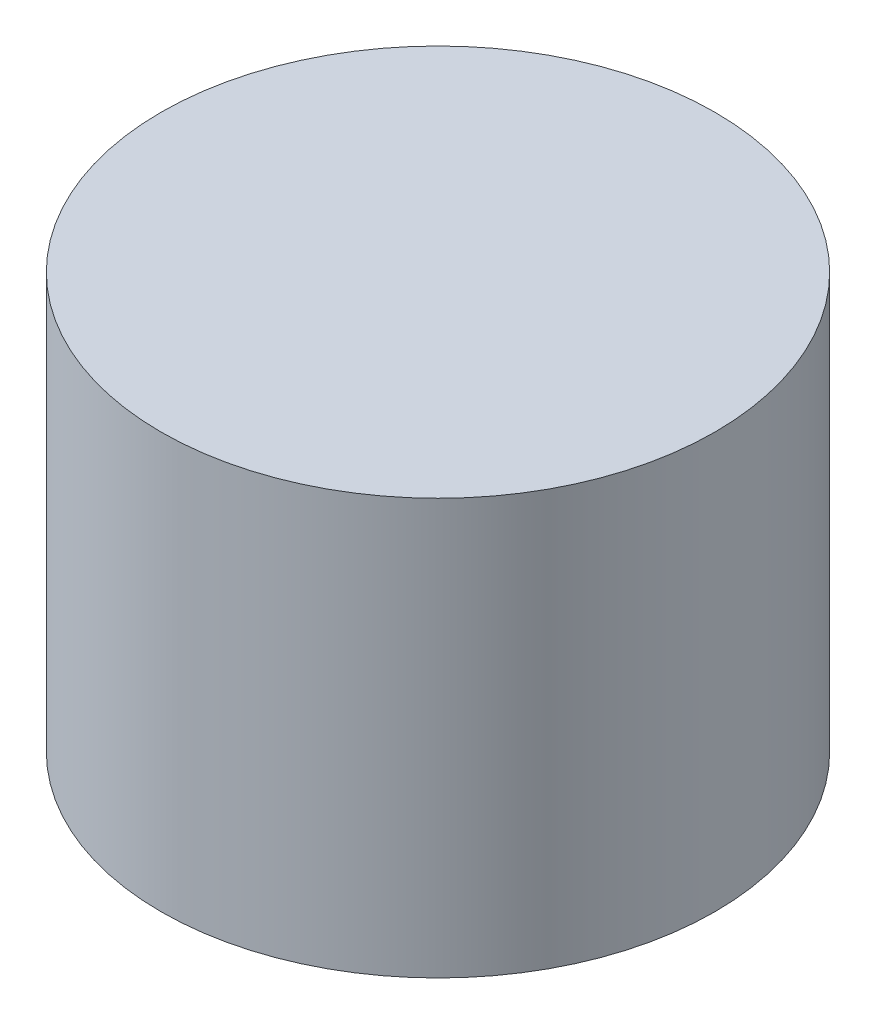
ISO-10303-21;
HEADER;
FILE_DESCRIPTION(('STEP AP214'),'2;1');
FILE_NAME('part.step','',(''),(''),'','','');
FILE_SCHEMA(('AUTOMOTIVE_DESIGN { 1 0 10303 214 1 1 1 1 }'));
ENDSEC;
DATA;
#1=APPLICATION_CONTEXT('core data for automotive mechanical design processes');
#2=APPLICATION_PROTOCOL_DEFINITION('international standard','automotive_design',2000,#1);
#3=PRODUCT_CONTEXT('',#1,'mechanical');
#4=PRODUCT('Part','Part','',(#3));
#5=PRODUCT_RELATED_PRODUCT_CATEGORY('part','',(#4));
#6=PRODUCT_DEFINITION_FORMATION('','',#4);
#7=PRODUCT_DEFINITION_CONTEXT('part definition',#1,'design');
#8=PRODUCT_DEFINITION('design','',#6,#7);
#9=PRODUCT_DEFINITION_SHAPE('','',#8);
#10=(LENGTH_UNIT() NAMED_UNIT(*) SI_UNIT(.MILLI.,.METRE.));
#11=(NAMED_UNIT(*) PLANE_ANGLE_UNIT() SI_UNIT($,.RADIAN.));
#12=(NAMED_UNIT(*) SI_UNIT($,.STERADIAN.) SOLID_ANGLE_UNIT());
#13=UNCERTAINTY_MEASURE_WITH_UNIT(LENGTH_MEASURE(1.E-05),#10,'distance_accuracy_value','');
#14=(GEOMETRIC_REPRESENTATION_CONTEXT(3) GLOBAL_UNCERTAINTY_ASSIGNED_CONTEXT((#13)) GLOBAL_UNIT_ASSIGNED_CONTEXT((#10,
#11,#12)) REPRESENTATION_CONTEXT('',''));
#15=CARTESIAN_POINT('',(0.,0.,0.));
#16=DIRECTION('',(0.,0.,1.));
#17=DIRECTION('',(1.,0.,0.));
#18=AXIS2_PLACEMENT_3D('',#15,#16,#17);
#19=CARTESIAN_POINT('',(0.,38.1,0.));
#20=DIRECTION('',(0.,-1.,0.));
#21=DIRECTION('',(0.,0.,-1.));
#22=AXIS2_PLACEMENT_3D('',#19,#20,#21);
#23=CYLINDRICAL_SURFACE('',#22,25.4);
#24=CARTESIAN_POINT('',(0.,38.1,0.));
#25=DIRECTION('',(0.,1.,0.));
#26=DIRECTION('',(0.,0.,1.));
#27=AXIS2_PLACEMENT_3D('',#24,#25,#26);
#28=CIRCLE('',#27,25.4);
#29=CARTESIAN_POINT('',(0.,38.1,-25.4));
#30=VERTEX_POINT('',#29);
#31=EDGE_CURVE('E10',#30,#30,#28,.T.);
#32=CARTESIAN_POINT('',(0.,0.,0.));
#33=DIRECTION('',(0.,1.,0.));
#34=DIRECTION('',(0.,0.,1.));
#35=AXIS2_PLACEMENT_3D('',#32,#33,#34);
#36=CIRCLE('',#35,25.4);
#37=CARTESIAN_POINT('',(0.,0.,-25.4));
#38=VERTEX_POINT('',#37);
#39=EDGE_CURVE('E46',#38,#38,#36,.T.);
#40=CARTESIAN_POINT('',(0.,38.1,-25.4));
#41=CARTESIAN_POINT('',(0.,37.703125,-25.4));
#42=CARTESIAN_POINT('',(0.,37.30625,-25.4));
#43=CARTESIAN_POINT('',(0.,36.5125,-25.4));
#44=CARTESIAN_POINT('',(0.,36.115625,-25.4));
#45=CARTESIAN_POINT('',(0.,35.321875,-25.4));
#46=CARTESIAN_POINT('',(0.,34.925,-25.4));
#47=CARTESIAN_POINT('',(0.,34.13125,-25.4));
#48=CARTESIAN_POINT('',(0.,33.734375,-25.4));
#49=CARTESIAN_POINT('',(0.,32.940625,-25.4));
#50=CARTESIAN_POINT('',(0.,32.54375,-25.4));
#51=CARTESIAN_POINT('',(0.,31.75,-25.4));
#52=CARTESIAN_POINT('',(0.,31.353125,-25.4));
#53=CARTESIAN_POINT('',(0.,30.559375,-25.4));
#54=CARTESIAN_POINT('',(0.,30.1625,-25.4));
#55=CARTESIAN_POINT('',(0.,29.36875,-25.4));
#56=CARTESIAN_POINT('',(0.,28.971875,-25.4));
#57=CARTESIAN_POINT('',(0.,28.178125,-25.4));
#58=CARTESIAN_POINT('',(0.,27.78125,-25.4));
#59=CARTESIAN_POINT('',(0.,26.9875,-25.4));
#60=CARTESIAN_POINT('',(0.,26.590625,-25.4));
#61=CARTESIAN_POINT('',(0.,25.796875,-25.4));
#62=CARTESIAN_POINT('',(0.,25.4,-25.4));
#63=CARTESIAN_POINT('',(0.,24.60625,-25.4));
#64=CARTESIAN_POINT('',(0.,24.209375,-25.4));
#65=CARTESIAN_POINT('',(0.,23.415625,-25.4));
#66=CARTESIAN_POINT('',(0.,23.01875,-25.4));
#67=CARTESIAN_POINT('',(0.,22.225,-25.4));
#68=CARTESIAN_POINT('',(0.,21.828125,-25.4));
#69=CARTESIAN_POINT('',(0.,21.034375,-25.4));
#70=CARTESIAN_POINT('',(0.,20.6375,-25.4));
#71=CARTESIAN_POINT('',(0.,19.84375,-25.4));
#72=CARTESIAN_POINT('',(0.,19.446875,-25.4));
#73=CARTESIAN_POINT('',(0.,18.653125,-25.4));
#74=CARTESIAN_POINT('',(0.,18.25625,-25.4));
#75=CARTESIAN_POINT('',(0.,17.4625,-25.4));
#76=CARTESIAN_POINT('',(0.,17.065625,-25.4));
#77=CARTESIAN_POINT('',(0.,16.271875,-25.4));
#78=CARTESIAN_POINT('',(0.,15.875,-25.4));
#79=CARTESIAN_POINT('',(0.,15.08125,-25.4));
#80=CARTESIAN_POINT('',(0.,14.684375,-25.4));
#81=CARTESIAN_POINT('',(0.,13.890625,-25.4));
#82=CARTESIAN_POINT('',(0.,13.49375,-25.4));
#83=CARTESIAN_POINT('',(0.,12.7,-25.4));
#84=CARTESIAN_POINT('',(0.,12.303125,-25.4));
#85=CARTESIAN_POINT('',(0.,11.509375,-25.4));
#86=CARTESIAN_POINT('',(0.,11.1125,-25.4));
#87=CARTESIAN_POINT('',(0.,10.31875,-25.4));
#88=CARTESIAN_POINT('',(0.,9.921875,-25.4));
#89=CARTESIAN_POINT('',(0.,9.128125,-25.4));
#90=CARTESIAN_POINT('',(0.,8.73125,-25.4));
#91=CARTESIAN_POINT('',(0.,7.9375,-25.4));
#92=CARTESIAN_POINT('',(0.,7.540625,-25.4));
#93=CARTESIAN_POINT('',(0.,6.746875,-25.4));
#94=CARTESIAN_POINT('',(0.,6.35,-25.4));
#95=CARTESIAN_POINT('',(0.,5.55625,-25.4));
#96=CARTESIAN_POINT('',(0.,5.159375,-25.4));
#97=CARTESIAN_POINT('',(0.,4.365625,-25.4));
#98=CARTESIAN_POINT('',(0.,3.96875,-25.4));
#99=CARTESIAN_POINT('',(0.,3.175,-25.4));
#100=CARTESIAN_POINT('',(0.,2.778125,-25.4));
#101=CARTESIAN_POINT('',(0.,1.984375,-25.4));
#102=CARTESIAN_POINT('',(0.,1.5875,-25.4));
#103=CARTESIAN_POINT('',(0.,0.79375,-25.4));
#104=CARTESIAN_POINT('',(0.,0.396875,-25.4));
#105=CARTESIAN_POINT('',(0.,0.,-25.4));
#106=B_SPLINE_CURVE_WITH_KNOTS('',3,(#40,#41,#42,#43,#44,#45,#46,#47,#48,#49,#50,#51,#52,#53,
#54,#55,#56,#57,#58,#59,#60,#61,#62,#63,#64,#65,#66,#67,#68,#69,#70,#71,#72,#73,#74,#75,#76,#77,
#78,#79,#80,#81,#82,#83,#84,#85,#86,#87,#88,#89,#90,#91,#92,#93,#94,#95,#96,#97,#98,#99,#100,
#101,#102,#103,#104,#105),.UNSPECIFIED.,.F.,.F.,(4,2,2,2,2,2,2,2,2,2,2,2,2,2,2,2,2,2,2,2,2,2,2,
2,2,2,2,2,2,2,2,2,4),(0.,1.19062499999999,2.38124999999999,3.571875,4.7625,5.953125,7.14375,
8.33437499999999,9.525,10.715625,11.90625,13.096875,14.2875,15.478125,16.66875,17.859375,19.05,
20.240625,21.43125,22.621875,23.8125,25.003125,26.19375,27.384375,28.575,29.765625,30.95625,
32.146875,33.3375,34.528125,35.71875,36.909375,38.1),.UNSPECIFIED.);
#107=EDGE_CURVE('BSEAM43',#30,#38,#106,.T.);
#108=ORIENTED_EDGE('',*,*,#31,.F.);
#109=ORIENTED_EDGE('',*,*,#39,.T.);
#110=ORIENTED_EDGE('',*,*,#107,.T.);
#111=ORIENTED_EDGE('',*,*,#107,.F.);
#112=EDGE_LOOP('',(#108,#110,#109,#111));
#113=FACE_BOUND('',#112,.T.);
#114=ADVANCED_FACE('F43',(#113),#23,.T.);
#115=CARTESIAN_POINT('',(0.,38.1,0.));
#116=DIRECTION('',(0.,1.,0.));
#117=DIRECTION('',(0.,0.,1.));
#118=AXIS2_PLACEMENT_3D('',#115,#116,#117);
#119=PLANE('',#118);
#120=ORIENTED_EDGE('',*,*,#31,.T.);
#121=EDGE_LOOP('',(#120));
#122=FACE_BOUND('',#121,.T.);
#123=ADVANCED_FACE('F60',(#122),#119,.T.);
#124=CARTESIAN_POINT('',(0.,0.,0.));
#125=DIRECTION('',(0.,1.,0.));
#126=DIRECTION('',(0.,0.,1.));
#127=AXIS2_PLACEMENT_3D('',#124,#125,#126);
#128=PLANE('',#127);
#129=ORIENTED_EDGE('',*,*,#39,.F.);
#130=EDGE_LOOP('',(#129));
#131=FACE_BOUND('',#130,.T.);
#132=ADVANCED_FACE('F58',(#131),#128,.F.);
#133=CLOSED_SHELL('',(#114,#123,#132));
#134=MANIFOLD_SOLID_BREP('B2',#133);
#135=ADVANCED_BREP_SHAPE_REPRESENTATION('',(#18,#134),#14);
#136=SHAPE_DEFINITION_REPRESENTATION(#9,#135);
ENDSEC;
END-ISO-10303-21;
